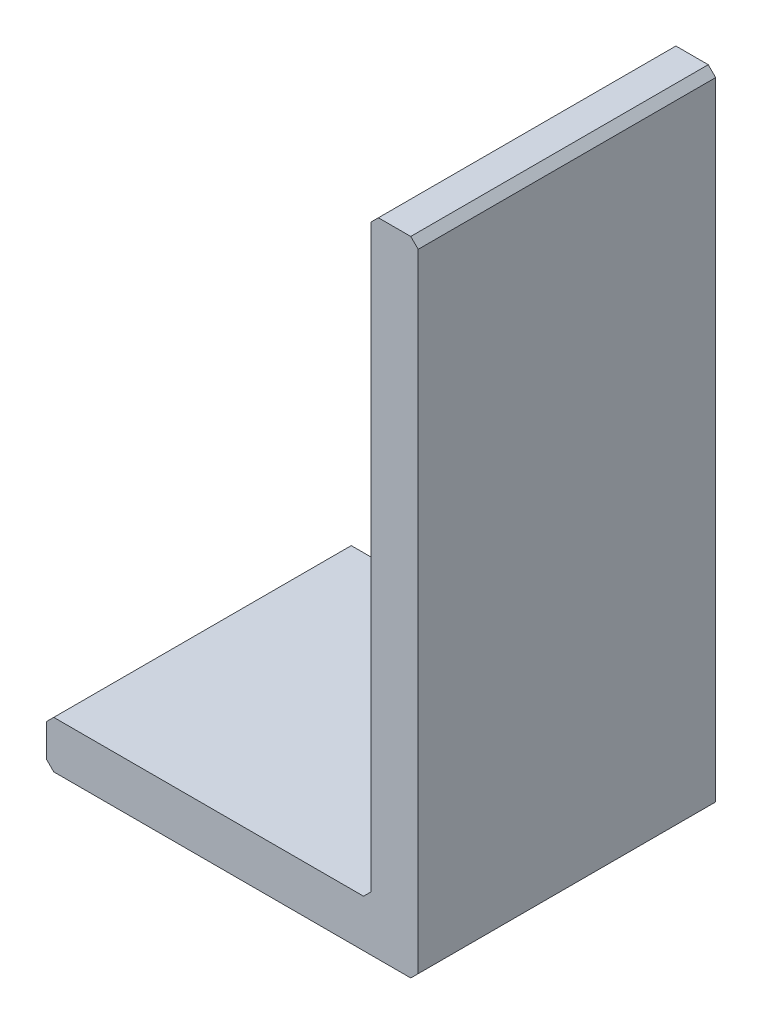
ISO-10303-21;
HEADER;
FILE_DESCRIPTION(('STEP AP214'),'2;1');
FILE_NAME('part.step','',(''),(''),'','','');
FILE_SCHEMA(('AUTOMOTIVE_DESIGN { 1 0 10303 214 1 1 1 1 }'));
ENDSEC;
DATA;
#1=APPLICATION_CONTEXT('core data for automotive mechanical design processes');
#2=APPLICATION_PROTOCOL_DEFINITION('international standard','automotive_design',2000,#1);
#3=PRODUCT_CONTEXT('',#1,'mechanical');
#4=PRODUCT('Part','Part','',(#3));
#5=PRODUCT_RELATED_PRODUCT_CATEGORY('part','',(#4));
#6=PRODUCT_DEFINITION_FORMATION('','',#4);
#7=PRODUCT_DEFINITION_CONTEXT('part definition',#1,'design');
#8=PRODUCT_DEFINITION('design','',#6,#7);
#9=PRODUCT_DEFINITION_SHAPE('','',#8);
#10=(LENGTH_UNIT() NAMED_UNIT(*) SI_UNIT(.MILLI.,.METRE.));
#11=(NAMED_UNIT(*) PLANE_ANGLE_UNIT() SI_UNIT($,.RADIAN.));
#12=(NAMED_UNIT(*) SI_UNIT($,.STERADIAN.) SOLID_ANGLE_UNIT());
#13=UNCERTAINTY_MEASURE_WITH_UNIT(LENGTH_MEASURE(1.E-05),#10,'distance_accuracy_value','');
#14=(GEOMETRIC_REPRESENTATION_CONTEXT(3) GLOBAL_UNCERTAINTY_ASSIGNED_CONTEXT((#13)) GLOBAL_UNIT_ASSIGNED_CONTEXT((#10,
#11,#12)) REPRESENTATION_CONTEXT('',''));
#15=CARTESIAN_POINT('',(0.,0.,0.));
#16=DIRECTION('',(0.,0.,1.));
#17=DIRECTION('',(1.,0.,0.));
#18=AXIS2_PLACEMENT_3D('',#15,#16,#17);
#19=CARTESIAN_POINT('',(0.,3.175,0.));
#20=DIRECTION('',(0.,-1.,0.));
#21=DIRECTION('',(0.,0.,-1.));
#22=AXIS2_PLACEMENT_3D('',#19,#20,#21);
#23=PLANE('',#22);
#24=DIRECTION('',(-1.,0.,0.));
#25=VECTOR('',#24,1.);
#26=CARTESIAN_POINT('',(-12.5,3.175,-10.));
#27=LINE('',#26,#25);
#28=CARTESIAN_POINT('',(8.825,3.175,-10.));
#29=VERTEX_POINT('',#28);
#30=CARTESIAN_POINT('',(-12.,3.175,-10.));
#31=VERTEX_POINT('',#30);
#32=EDGE_CURVE('E236',#29,#31,#27,.T.);
#33=ORIENTED_EDGE('',*,*,#32,.T.);
#34=DIRECTION('',(0.,0.,1.));
#35=VECTOR('',#34,1.);
#36=CARTESIAN_POINT('',(-12.,3.175,0.));
#37=LINE('',#36,#35);
#38=CARTESIAN_POINT('',(-12.,3.175,10.));
#39=VERTEX_POINT('',#38);
#40=EDGE_CURVE('E202',#31,#39,#37,.T.);
#41=ORIENTED_EDGE('',*,*,#40,.T.);
#42=DIRECTION('',(1.,0.,0.));
#43=VECTOR('',#42,1.);
#44=CARTESIAN_POINT('',(-12.5,3.175,10.));
#45=LINE('',#44,#43);
#46=CARTESIAN_POINT('',(8.82500000000001,3.175,10.));
#47=VERTEX_POINT('',#46);
#48=EDGE_CURVE('E138',#39,#47,#45,.T.);
#49=ORIENTED_EDGE('',*,*,#48,.T.);
#50=DIRECTION('',(0.,0.,-1.));
#51=VECTOR('',#50,1.);
#52=CARTESIAN_POINT('',(8.825,3.175,-10.));
#53=LINE('',#52,#51);
#54=EDGE_CURVE('E199',#47,#29,#53,.T.);
#55=ORIENTED_EDGE('',*,*,#54,.T.);
#56=EDGE_LOOP('',(#33,#41,#49,#55));
#57=FACE_BOUND('',#56,.T.);
#58=ADVANCED_FACE('F41',(#57),#23,.F.);
#59=CARTESIAN_POINT('',(12.5,3.175,10.));
#60=DIRECTION('',(-1.,0.,0.));
#61=DIRECTION('',(0.,0.,1.));
#62=AXIS2_PLACEMENT_3D('',#59,#60,#61);
#63=PLANE('',#62);
#64=DIRECTION('',(0.,-1.,0.));
#65=VECTOR('',#64,1.);
#66=CARTESIAN_POINT('',(12.5,3.175,-10.));
#67=LINE('',#66,#65);
#68=CARTESIAN_POINT('',(12.5,42.675,-10.));
#69=VERTEX_POINT('',#68);
#70=CARTESIAN_POINT('',(12.5,0.5,-10.));
#71=VERTEX_POINT('',#70);
#72=EDGE_CURVE('E163',#69,#71,#67,.T.);
#73=ORIENTED_EDGE('',*,*,#72,.F.);
#74=DIRECTION('',(0.,0.,1.));
#75=VECTOR('',#74,1.);
#76=CARTESIAN_POINT('',(12.5,42.675,10.));
#77=LINE('',#76,#75);
#78=CARTESIAN_POINT('',(12.5,42.675,10.));
#79=VERTEX_POINT('',#78);
#80=EDGE_CURVE('E216',#69,#79,#77,.T.);
#81=ORIENTED_EDGE('',*,*,#80,.T.);
#82=DIRECTION('',(0.,-1.,0.));
#83=VECTOR('',#82,1.);
#84=CARTESIAN_POINT('',(12.5,3.175,10.));
#85=LINE('',#84,#83);
#86=CARTESIAN_POINT('',(12.5,0.5,10.));
#87=VERTEX_POINT('',#86);
#88=EDGE_CURVE('E157',#79,#87,#85,.T.);
#89=ORIENTED_EDGE('',*,*,#88,.T.);
#90=DIRECTION('',(0.,0.,-1.));
#91=VECTOR('',#90,1.);
#92=CARTESIAN_POINT('',(12.5,0.5,-10.));
#93=LINE('',#92,#91);
#94=EDGE_CURVE('E213',#87,#71,#93,.T.);
#95=ORIENTED_EDGE('',*,*,#94,.T.);
#96=EDGE_LOOP('',(#73,#81,#89,#95));
#97=FACE_BOUND('',#96,.T.);
#98=ADVANCED_FACE('F280',(#97),#63,.F.);
#99=CARTESIAN_POINT('',(-12.5,3.175,-10.));
#100=DIRECTION('',(0.,0.,1.));
#101=DIRECTION('',(1.,0.,0.));
#102=AXIS2_PLACEMENT_3D('',#99,#100,#101);
#103=PLANE('',#102);
#104=DIRECTION('',(-1.,0.,0.));
#105=VECTOR('',#104,1.);
#106=CARTESIAN_POINT('',(-12.5,0.,-10.));
#107=LINE('',#106,#105);
#108=CARTESIAN_POINT('',(12.,0.,-10.));
#109=VERTEX_POINT('',#108);
#110=CARTESIAN_POINT('',(-12.,0.,-10.));
#111=VERTEX_POINT('',#110);
#112=EDGE_CURVE('E249',#109,#111,#107,.T.);
#113=ORIENTED_EDGE('',*,*,#112,.T.);
#114=DIRECTION('',(-0.707106781186547,0.707106781186548,0.));
#115=VECTOR('',#114,1.);
#116=CARTESIAN_POINT('',(-12.5,0.500000000000001,-10.));
#117=LINE('',#116,#115);
#118=CARTESIAN_POINT('',(-12.5,0.5,-10.));
#119=VERTEX_POINT('',#118);
#120=EDGE_CURVE('E196',#111,#119,#117,.T.);
#121=ORIENTED_EDGE('',*,*,#120,.T.);
#122=DIRECTION('',(0.,-1.,0.));
#123=VECTOR('',#122,1.);
#124=CARTESIAN_POINT('',(-12.5,3.175,-10.));
#125=LINE('',#124,#123);
#126=CARTESIAN_POINT('',(-12.5,2.67499999999999,-10.));
#127=VERTEX_POINT('',#126);
#128=EDGE_CURVE('E156',#127,#119,#125,.T.);
#129=ORIENTED_EDGE('',*,*,#128,.F.);
#130=DIRECTION('',(-0.707106781186547,-0.707106781186548,0.));
#131=VECTOR('',#130,1.);
#132=CARTESIAN_POINT('',(-12.,3.175,-10.));
#133=LINE('',#132,#131);
#134=EDGE_CURVE('E161',#127,#31,#133,.F.);
#135=ORIENTED_EDGE('',*,*,#134,.T.);
#136=ORIENTED_EDGE('',*,*,#32,.F.);
#137=DIRECTION('',(-0.707106781186549,-0.707106781186546,0.));
#138=VECTOR('',#137,1.);
#139=CARTESIAN_POINT('',(-1.83750000000005,-7.4875,-10.));
#140=LINE('',#139,#138);
#141=CARTESIAN_POINT('',(9.325,3.675,-10.));
#142=VERTEX_POINT('',#141);
#143=EDGE_CURVE('E11',#29,#142,#140,.F.);
#144=ORIENTED_EDGE('',*,*,#143,.T.);
#145=DIRECTION('',(0.,-1.,0.));
#146=VECTOR('',#145,1.);
#147=CARTESIAN_POINT('',(9.325,43.175,-10.));
#148=LINE('',#147,#146);
#149=CARTESIAN_POINT('',(9.325,42.675,-10.));
#150=VERTEX_POINT('',#149);
#151=EDGE_CURVE('E243',#150,#142,#148,.T.);
#152=ORIENTED_EDGE('',*,*,#151,.F.);
#153=DIRECTION('',(-0.707106781186548,-0.707106781186548,0.));
#154=VECTOR('',#153,1.);
#155=CARTESIAN_POINT('',(9.82500000000001,43.175,-10.));
#156=LINE('',#155,#154);
#157=CARTESIAN_POINT('',(9.82500000000001,43.175,-10.));
#158=VERTEX_POINT('',#157);
#159=EDGE_CURVE('E189',#150,#158,#156,.F.);
#160=ORIENTED_EDGE('',*,*,#159,.T.);
#161=DIRECTION('',(-1.,0.,0.));
#162=VECTOR('',#161,1.);
#163=CARTESIAN_POINT('',(12.5,43.175,-10.));
#164=LINE('',#163,#162);
#165=CARTESIAN_POINT('',(12.,43.175,-10.));
#166=VERTEX_POINT('',#165);
#167=EDGE_CURVE('E292',#166,#158,#164,.T.);
#168=ORIENTED_EDGE('',*,*,#167,.F.);
#169=DIRECTION('',(-0.707106781186548,0.707106781186547,0.));
#170=VECTOR('',#169,1.);
#171=CARTESIAN_POINT('',(12.,43.175,-10.));
#172=LINE('',#171,#170);
#173=EDGE_CURVE('E66',#166,#69,#172,.F.);
#174=ORIENTED_EDGE('',*,*,#173,.T.);
#175=ORIENTED_EDGE('',*,*,#72,.T.);
#176=DIRECTION('',(-0.707106781186548,-0.707106781186547,0.));
#177=VECTOR('',#176,1.);
#178=CARTESIAN_POINT('',(12.5,0.5,-10.));
#179=LINE('',#178,#177);
#180=EDGE_CURVE('E58',#71,#109,#179,.T.);
#181=ORIENTED_EDGE('',*,*,#180,.T.);
#182=EDGE_LOOP('',(#113,#121,#129,#135,#136,#144,#152,#160,#168,#174,#175,#181));
#183=FACE_BOUND('',#182,.T.);
#184=ADVANCED_FACE('F242',(#183),#103,.F.);
#185=CARTESIAN_POINT('',(-12.5,3.175,10.));
#186=DIRECTION('',(1.,0.,0.));
#187=DIRECTION('',(0.,0.,-1.));
#188=AXIS2_PLACEMENT_3D('',#185,#186,#187);
#189=PLANE('',#188);
#190=ORIENTED_EDGE('',*,*,#128,.T.);
#191=DIRECTION('',(0.,0.,1.));
#192=VECTOR('',#191,1.);
#193=CARTESIAN_POINT('',(-12.5,0.5,10.));
#194=LINE('',#193,#192);
#195=CARTESIAN_POINT('',(-12.5,0.5,10.));
#196=VERTEX_POINT('',#195);
#197=EDGE_CURVE('E154',#119,#196,#194,.T.);
#198=ORIENTED_EDGE('',*,*,#197,.T.);
#199=DIRECTION('',(0.,-1.,0.));
#200=VECTOR('',#199,1.);
#201=CARTESIAN_POINT('',(-12.5,3.175,10.));
#202=LINE('',#201,#200);
#203=CARTESIAN_POINT('',(-12.5,2.67499999999999,10.));
#204=VERTEX_POINT('',#203);
#205=EDGE_CURVE('E136',#204,#196,#202,.T.);
#206=ORIENTED_EDGE('',*,*,#205,.F.);
#207=DIRECTION('',(0.,0.,-1.));
#208=VECTOR('',#207,1.);
#209=CARTESIAN_POINT('',(-12.5,2.67499999999999,10.));
#210=LINE('',#209,#208);
#211=EDGE_CURVE('E151',#204,#127,#210,.T.);
#212=ORIENTED_EDGE('',*,*,#211,.T.);
#213=EDGE_LOOP('',(#190,#198,#206,#212));
#214=FACE_BOUND('',#213,.T.);
#215=ADVANCED_FACE('F150',(#214),#189,.F.);
#216=CARTESIAN_POINT('',(-12.5,3.175,10.));
#217=DIRECTION('',(0.,0.,-1.));
#218=DIRECTION('',(-1.,0.,0.));
#219=AXIS2_PLACEMENT_3D('',#216,#217,#218);
#220=PLANE('',#219);
#221=ORIENTED_EDGE('',*,*,#205,.T.);
#222=DIRECTION('',(0.707106781186547,-0.707106781186548,0.));
#223=VECTOR('',#222,1.);
#224=CARTESIAN_POINT('',(-12.5,0.5,10.));
#225=LINE('',#224,#223);
#226=CARTESIAN_POINT('',(-12.,0.,10.));
#227=VERTEX_POINT('',#226);
#228=EDGE_CURVE('E144',#196,#227,#225,.T.);
#229=ORIENTED_EDGE('',*,*,#228,.T.);
#230=DIRECTION('',(1.,0.,0.));
#231=VECTOR('',#230,1.);
#232=CARTESIAN_POINT('',(-12.5,0.,10.));
#233=LINE('',#232,#231);
#234=CARTESIAN_POINT('',(12.,0.,10.));
#235=VERTEX_POINT('',#234);
#236=EDGE_CURVE('E253',#227,#235,#233,.T.);
#237=ORIENTED_EDGE('',*,*,#236,.T.);
#238=DIRECTION('',(0.707106781186548,0.707106781186547,0.));
#239=VECTOR('',#238,1.);
#240=CARTESIAN_POINT('',(12.5,0.5,10.));
#241=LINE('',#240,#239);
#242=EDGE_CURVE('E167',#235,#87,#241,.T.);
#243=ORIENTED_EDGE('',*,*,#242,.T.);
#244=ORIENTED_EDGE('',*,*,#88,.F.);
#245=DIRECTION('',(0.707106781186548,-0.707106781186547,0.));
#246=VECTOR('',#245,1.);
#247=CARTESIAN_POINT('',(12.,43.175,10.));
#248=LINE('',#247,#246);
#249=CARTESIAN_POINT('',(12.,43.175,10.));
#250=VERTEX_POINT('',#249);
#251=EDGE_CURVE('E145',#79,#250,#248,.F.);
#252=ORIENTED_EDGE('',*,*,#251,.T.);
#253=DIRECTION('',(1.,0.,0.));
#254=VECTOR('',#253,1.);
#255=CARTESIAN_POINT('',(12.5,43.175,10.));
#256=LINE('',#255,#254);
#257=CARTESIAN_POINT('',(9.82500000000001,43.175,10.));
#258=VERTEX_POINT('',#257);
#259=EDGE_CURVE('E255',#258,#250,#256,.T.);
#260=ORIENTED_EDGE('',*,*,#259,.F.);
#261=DIRECTION('',(0.707106781186548,0.707106781186548,0.));
#262=VECTOR('',#261,1.);
#263=CARTESIAN_POINT('',(9.82500000000001,43.175,10.));
#264=LINE('',#263,#262);
#265=CARTESIAN_POINT('',(9.32500000000001,42.675,10.));
#266=VERTEX_POINT('',#265);
#267=EDGE_CURVE('E174',#258,#266,#264,.F.);
#268=ORIENTED_EDGE('',*,*,#267,.T.);
#269=DIRECTION('',(0.,-1.,0.));
#270=VECTOR('',#269,1.);
#271=CARTESIAN_POINT('',(9.32500000000001,43.175,10.));
#272=LINE('',#271,#270);
#273=CARTESIAN_POINT('',(9.32500000000001,3.675,10.));
#274=VERTEX_POINT('',#273);
#275=EDGE_CURVE('E228',#266,#274,#272,.T.);
#276=ORIENTED_EDGE('',*,*,#275,.T.);
#277=DIRECTION('',(0.707106781186549,0.707106781186546,0.));
#278=VECTOR('',#277,1.);
#279=CARTESIAN_POINT('',(-1.83750000000005,-7.4875,10.));
#280=LINE('',#279,#278);
#281=EDGE_CURVE('E51',#274,#47,#280,.F.);
#282=ORIENTED_EDGE('',*,*,#281,.T.);
#283=ORIENTED_EDGE('',*,*,#48,.F.);
#284=DIRECTION('',(0.707106781186547,0.707106781186548,0.));
#285=VECTOR('',#284,1.);
#286=CARTESIAN_POINT('',(-12.,3.175,10.));
#287=LINE('',#286,#285);
#288=EDGE_CURVE('E133',#39,#204,#287,.F.);
#289=ORIENTED_EDGE('',*,*,#288,.T.);
#290=EDGE_LOOP('',(#221,#229,#237,#243,#244,#252,#260,#268,#276,#282,#283,#289));
#291=FACE_BOUND('',#290,.T.);
#292=ADVANCED_FACE('F135',(#291),#220,.F.);
#293=CARTESIAN_POINT('',(0.,0.,0.));
#294=DIRECTION('',(0.,-1.,0.));
#295=DIRECTION('',(0.,0.,-1.));
#296=AXIS2_PLACEMENT_3D('',#293,#294,#295);
#297=PLANE('',#296);
#298=ORIENTED_EDGE('',*,*,#236,.F.);
#299=DIRECTION('',(0.,0.,-1.));
#300=VECTOR('',#299,1.);
#301=CARTESIAN_POINT('',(-12.,0.,-10.));
#302=LINE('',#301,#300);
#303=EDGE_CURVE('E184',#227,#111,#302,.T.);
#304=ORIENTED_EDGE('',*,*,#303,.T.);
#305=ORIENTED_EDGE('',*,*,#112,.F.);
#306=DIRECTION('',(0.,0.,1.));
#307=VECTOR('',#306,1.);
#308=CARTESIAN_POINT('',(12.,0.,10.));
#309=LINE('',#308,#307);
#310=EDGE_CURVE('E181',#109,#235,#309,.T.);
#311=ORIENTED_EDGE('',*,*,#310,.T.);
#312=EDGE_LOOP('',(#298,#304,#305,#311));
#313=FACE_BOUND('',#312,.T.);
#314=ADVANCED_FACE('F274',(#313),#297,.T.);
#315=CARTESIAN_POINT('',(9.325,43.175,-10.));
#316=DIRECTION('',(1.,0.,0.));
#317=DIRECTION('',(0.,0.,-1.));
#318=AXIS2_PLACEMENT_3D('',#315,#316,#317);
#319=PLANE('',#318);
#320=ORIENTED_EDGE('',*,*,#275,.F.);
#321=DIRECTION('',(0.,0.,-1.));
#322=VECTOR('',#321,1.);
#323=CARTESIAN_POINT('',(9.325,42.675,-10.));
#324=LINE('',#323,#322);
#325=EDGE_CURVE('E223',#266,#150,#324,.T.);
#326=ORIENTED_EDGE('',*,*,#325,.T.);
#327=ORIENTED_EDGE('',*,*,#151,.T.);
#328=DIRECTION('',(0.,0.,1.));
#329=VECTOR('',#328,1.);
#330=CARTESIAN_POINT('',(9.32500000000001,3.675,10.));
#331=LINE('',#330,#329);
#332=EDGE_CURVE('E219',#142,#274,#331,.T.);
#333=ORIENTED_EDGE('',*,*,#332,.T.);
#334=EDGE_LOOP('',(#320,#326,#327,#333));
#335=FACE_BOUND('',#334,.T.);
#336=ADVANCED_FACE('F246',(#335),#319,.F.);
#337=CARTESIAN_POINT('',(0.,43.175,0.));
#338=DIRECTION('',(0.,-1.,0.));
#339=DIRECTION('',(0.,0.,-1.));
#340=AXIS2_PLACEMENT_3D('',#337,#338,#339);
#341=PLANE('',#340);
#342=ORIENTED_EDGE('',*,*,#259,.T.);
#343=DIRECTION('',(0.,0.,-1.));
#344=VECTOR('',#343,1.);
#345=CARTESIAN_POINT('',(12.,43.175,0.));
#346=LINE('',#345,#344);
#347=EDGE_CURVE('E209',#250,#166,#346,.T.);
#348=ORIENTED_EDGE('',*,*,#347,.T.);
#349=ORIENTED_EDGE('',*,*,#167,.T.);
#350=DIRECTION('',(0.,0.,1.));
#351=VECTOR('',#350,1.);
#352=CARTESIAN_POINT('',(9.82500000000001,43.175,0.));
#353=LINE('',#352,#351);
#354=EDGE_CURVE('E205',#158,#258,#353,.T.);
#355=ORIENTED_EDGE('',*,*,#354,.T.);
#356=EDGE_LOOP('',(#342,#348,#349,#355));
#357=FACE_BOUND('',#356,.T.);
#358=ADVANCED_FACE('F288',(#357),#341,.F.);
#359=CARTESIAN_POINT('',(-12.5,0.5,10.));
#360=DIRECTION('',(-0.707106781186548,-0.707106781186547,0.));
#361=DIRECTION('',(0.,0.,-1.));
#362=AXIS2_PLACEMENT_3D('',#359,#360,#361);
#363=PLANE('',#362);
#364=ORIENTED_EDGE('',*,*,#120,.F.);
#365=ORIENTED_EDGE('',*,*,#303,.F.);
#366=ORIENTED_EDGE('',*,*,#228,.F.);
#367=ORIENTED_EDGE('',*,*,#197,.F.);
#368=EDGE_LOOP('',(#364,#365,#366,#367));
#369=FACE_BOUND('',#368,.T.);
#370=ADVANCED_FACE('F269',(#369),#363,.T.);
#371=CARTESIAN_POINT('',(-12.,3.175,0.));
#372=DIRECTION('',(0.707106781186548,-0.707106781186547,0.));
#373=DIRECTION('',(0.,0.,1.));
#374=AXIS2_PLACEMENT_3D('',#371,#372,#373);
#375=PLANE('',#374);
#376=ORIENTED_EDGE('',*,*,#134,.F.);
#377=ORIENTED_EDGE('',*,*,#211,.F.);
#378=ORIENTED_EDGE('',*,*,#288,.F.);
#379=ORIENTED_EDGE('',*,*,#40,.F.);
#380=EDGE_LOOP('',(#376,#377,#378,#379));
#381=FACE_BOUND('',#380,.T.);
#382=ADVANCED_FACE('F160',(#381),#375,.F.);
#383=CARTESIAN_POINT('',(12.,43.175,0.));
#384=DIRECTION('',(-0.707106781186547,-0.707106781186548,0.));
#385=DIRECTION('',(0.,0.,-1.));
#386=AXIS2_PLACEMENT_3D('',#383,#384,#385);
#387=PLANE('',#386);
#388=ORIENTED_EDGE('',*,*,#251,.F.);
#389=ORIENTED_EDGE('',*,*,#80,.F.);
#390=ORIENTED_EDGE('',*,*,#173,.F.);
#391=ORIENTED_EDGE('',*,*,#347,.F.);
#392=EDGE_LOOP('',(#388,#389,#390,#391));
#393=FACE_BOUND('',#392,.T.);
#394=ADVANCED_FACE('F283',(#393),#387,.F.);
#395=CARTESIAN_POINT('',(9.82500000000001,43.175,0.));
#396=DIRECTION('',(0.707106781186547,-0.707106781186547,0.));
#397=DIRECTION('',(0.,0.,1.));
#398=AXIS2_PLACEMENT_3D('',#395,#396,#397);
#399=PLANE('',#398);
#400=ORIENTED_EDGE('',*,*,#159,.F.);
#401=ORIENTED_EDGE('',*,*,#325,.F.);
#402=ORIENTED_EDGE('',*,*,#267,.F.);
#403=ORIENTED_EDGE('',*,*,#354,.F.);
#404=EDGE_LOOP('',(#400,#401,#402,#403));
#405=FACE_BOUND('',#404,.T.);
#406=ADVANCED_FACE('F296',(#405),#399,.F.);
#407=CARTESIAN_POINT('',(12.5,0.5,10.));
#408=DIRECTION('',(0.707106781186547,-0.707106781186548,0.));
#409=DIRECTION('',(0.,0.,1.));
#410=AXIS2_PLACEMENT_3D('',#407,#408,#409);
#411=PLANE('',#410);
#412=ORIENTED_EDGE('',*,*,#242,.F.);
#413=ORIENTED_EDGE('',*,*,#310,.F.);
#414=ORIENTED_EDGE('',*,*,#180,.F.);
#415=ORIENTED_EDGE('',*,*,#94,.F.);
#416=EDGE_LOOP('',(#412,#413,#414,#415));
#417=FACE_BOUND('',#416,.T.);
#418=ADVANCED_FACE('F276',(#417),#411,.T.);
#419=CARTESIAN_POINT('',(9.325,3.675,-10.));
#420=DIRECTION('',(-0.707106781186546,0.707106781186549,0.));
#421=DIRECTION('',(0.,0.,-1.));
#422=AXIS2_PLACEMENT_3D('',#419,#420,#421);
#423=PLANE('',#422);
#424=ORIENTED_EDGE('',*,*,#143,.F.);
#425=ORIENTED_EDGE('',*,*,#54,.F.);
#426=ORIENTED_EDGE('',*,*,#281,.F.);
#427=ORIENTED_EDGE('',*,*,#332,.F.);
#428=EDGE_LOOP('',(#424,#425,#426,#427));
#429=FACE_BOUND('',#428,.T.);
#430=ADVANCED_FACE('F44',(#429),#423,.T.);
#431=CLOSED_SHELL('',(#58,#98,#184,#215,#292,#314,#336,#358,#370,#382,#394,#406,#418,#430));
#432=MANIFOLD_SOLID_BREP('B2',#431);
#433=ADVANCED_BREP_SHAPE_REPRESENTATION('',(#18,#432),#14);
#434=SHAPE_DEFINITION_REPRESENTATION(#9,#433);
ENDSEC;
END-ISO-10303-21;
